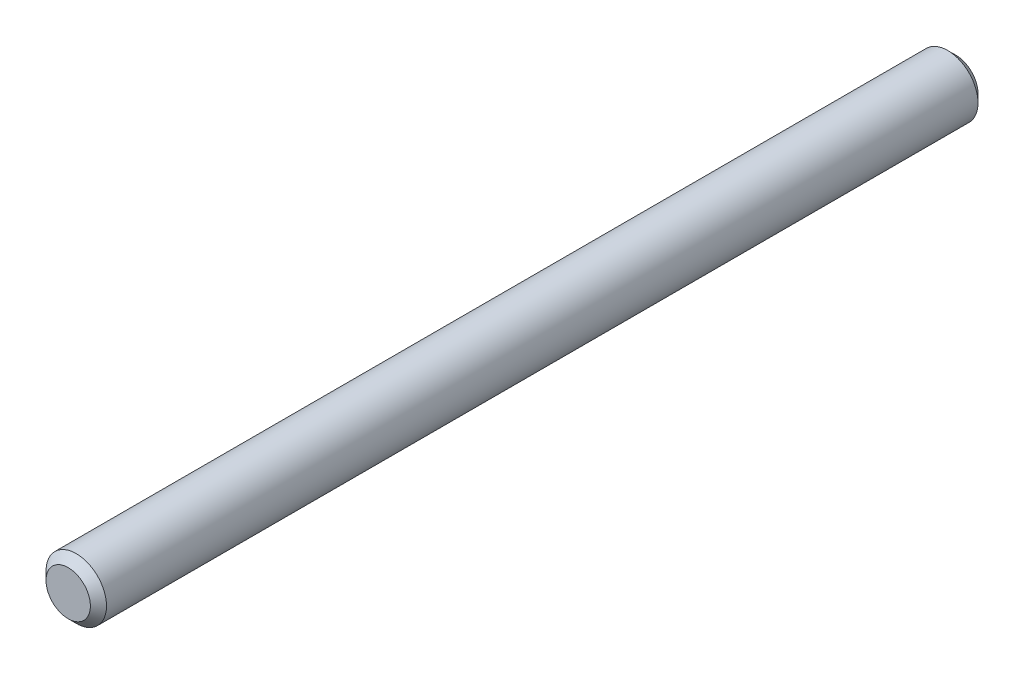
ISO-10303-21;
HEADER;
FILE_DESCRIPTION(('STEP AP214'),'2;1');
FILE_NAME('part.step','',(''),(''),'','','');
FILE_SCHEMA(('AUTOMOTIVE_DESIGN { 1 0 10303 214 1 1 1 1 }'));
ENDSEC;
DATA;
#1=APPLICATION_CONTEXT('core data for automotive mechanical design processes');
#2=APPLICATION_PROTOCOL_DEFINITION('international standard','automotive_design',2000,#1);
#3=PRODUCT_CONTEXT('',#1,'mechanical');
#4=PRODUCT('Part','Part','',(#3));
#5=PRODUCT_RELATED_PRODUCT_CATEGORY('part','',(#4));
#6=PRODUCT_DEFINITION_FORMATION('','',#4);
#7=PRODUCT_DEFINITION_CONTEXT('part definition',#1,'design');
#8=PRODUCT_DEFINITION('design','',#6,#7);
#9=PRODUCT_DEFINITION_SHAPE('','',#8);
#10=(LENGTH_UNIT() NAMED_UNIT(*) SI_UNIT(.MILLI.,.METRE.));
#11=(NAMED_UNIT(*) PLANE_ANGLE_UNIT() SI_UNIT($,.RADIAN.));
#12=(NAMED_UNIT(*) SI_UNIT($,.STERADIAN.) SOLID_ANGLE_UNIT());
#13=UNCERTAINTY_MEASURE_WITH_UNIT(LENGTH_MEASURE(1.E-05),#10,'distance_accuracy_value','');
#14=(GEOMETRIC_REPRESENTATION_CONTEXT(3) GLOBAL_UNCERTAINTY_ASSIGNED_CONTEXT((#13)) GLOBAL_UNIT_ASSIGNED_CONTEXT((#10,
#11,#12)) REPRESENTATION_CONTEXT('',''));
#15=CARTESIAN_POINT('',(0.,0.,0.));
#16=DIRECTION('',(0.,0.,1.));
#17=DIRECTION('',(1.,0.,0.));
#18=AXIS2_PLACEMENT_3D('',#15,#16,#17);
#19=CARTESIAN_POINT('',(0.,0.,110.));
#20=DIRECTION('',(0.,0.,-1.));
#21=DIRECTION('',(-1.,0.,0.));
#22=AXIS2_PLACEMENT_3D('',#19,#20,#21);
#23=CYLINDRICAL_SURFACE('',#22,7.5);
#24=CARTESIAN_POINT('',(0.,0.,108.));
#25=DIRECTION('',(0.,0.,1.));
#26=DIRECTION('',(1.,0.,0.));
#27=AXIS2_PLACEMENT_3D('',#24,#25,#26);
#28=CIRCLE('',#27,7.5);
#29=CARTESIAN_POINT('',(7.5,0.,108.));
#30=VERTEX_POINT('',#29);
#31=EDGE_CURVE('E10',#30,#30,#28,.F.);
#32=ORIENTED_EDGE('',*,*,#31,.T.);
#33=EDGE_LOOP('',(#32));
#34=FACE_BOUND('',#33,.T.);
#35=CARTESIAN_POINT('',(0.,0.,-108.));
#36=DIRECTION('',(0.,0.,1.));
#37=DIRECTION('',(1.,0.,0.));
#38=AXIS2_PLACEMENT_3D('',#35,#36,#37);
#39=CIRCLE('',#38,7.5);
#40=CARTESIAN_POINT('',(7.5,0.,-108.));
#41=VERTEX_POINT('',#40);
#42=EDGE_CURVE('E54',#41,#41,#39,.T.);
#43=ORIENTED_EDGE('',*,*,#42,.T.);
#44=EDGE_LOOP('',(#43));
#45=FACE_BOUND('',#44,.T.);
#46=ADVANCED_FACE('F39',(#34,#45),#23,.T.);
#47=CARTESIAN_POINT('',(0.,0.,110.));
#48=DIRECTION('',(0.,0.,1.));
#49=DIRECTION('',(1.,0.,0.));
#50=AXIS2_PLACEMENT_3D('',#47,#48,#49);
#51=PLANE('',#50);
#52=CARTESIAN_POINT('',(0.,0.,110.));
#53=DIRECTION('',(0.,0.,1.));
#54=DIRECTION('',(1.,0.,0.));
#55=AXIS2_PLACEMENT_3D('',#52,#53,#54);
#56=CIRCLE('',#55,5.50000000000001);
#57=CARTESIAN_POINT('',(5.50000000000001,0.,110.));
#58=VERTEX_POINT('',#57);
#59=EDGE_CURVE('E46',#58,#58,#56,.T.);
#60=ORIENTED_EDGE('',*,*,#59,.T.);
#61=EDGE_LOOP('',(#60));
#62=FACE_BOUND('',#61,.T.);
#63=ADVANCED_FACE('F71',(#62),#51,.T.);
#64=CARTESIAN_POINT('',(0.,0.,-110.));
#65=DIRECTION('',(0.,0.,1.));
#66=DIRECTION('',(1.,0.,0.));
#67=AXIS2_PLACEMENT_3D('',#64,#65,#66);
#68=PLANE('',#67);
#69=CARTESIAN_POINT('',(0.,0.,-110.));
#70=DIRECTION('',(0.,0.,1.));
#71=DIRECTION('',(1.,0.,0.));
#72=AXIS2_PLACEMENT_3D('',#69,#70,#71);
#73=CIRCLE('',#72,5.50000000000003);
#74=CARTESIAN_POINT('',(5.50000000000003,0.,-110.));
#75=VERTEX_POINT('',#74);
#76=EDGE_CURVE('E50',#75,#75,#73,.F.);
#77=ORIENTED_EDGE('',*,*,#76,.T.);
#78=EDGE_LOOP('',(#77));
#79=FACE_BOUND('',#78,.T.);
#80=ADVANCED_FACE('F63',(#79),#68,.F.);
#81=CARTESIAN_POINT('',(0.,0.,-108.));
#82=DIRECTION('',(0.,0.,1.));
#83=DIRECTION('',(1.,0.,0.));
#84=AXIS2_PLACEMENT_3D('',#81,#82,#83);
#85=CONICAL_SURFACE('',#84,7.5,0.785398163397454);
#86=ORIENTED_EDGE('',*,*,#76,.F.);
#87=EDGE_LOOP('',(#86));
#88=FACE_BOUND('',#87,.T.);
#89=ORIENTED_EDGE('',*,*,#42,.F.);
#90=EDGE_LOOP('',(#89));
#91=FACE_BOUND('',#90,.T.);
#92=ADVANCED_FACE('F61',(#88,#91),#85,.T.);
#93=CARTESIAN_POINT('',(0.,0.,110.));
#94=DIRECTION('',(0.,0.,-1.));
#95=DIRECTION('',(-1.,0.,0.));
#96=AXIS2_PLACEMENT_3D('',#93,#94,#95);
#97=CONICAL_SURFACE('',#96,5.50000000000001,0.785398163397453);
#98=ORIENTED_EDGE('',*,*,#31,.F.);
#99=EDGE_LOOP('',(#98));
#100=FACE_BOUND('',#99,.T.);
#101=ORIENTED_EDGE('',*,*,#59,.F.);
#102=EDGE_LOOP('',(#101));
#103=FACE_BOUND('',#102,.T.);
#104=ADVANCED_FACE('F41',(#100,#103),#97,.T.);
#105=CLOSED_SHELL('',(#46,#63,#80,#92,#104));
#106=MANIFOLD_SOLID_BREP('B2',#105);
#107=ADVANCED_BREP_SHAPE_REPRESENTATION('',(#18,#106),#14);
#108=SHAPE_DEFINITION_REPRESENTATION(#9,#107);
ENDSEC;
END-ISO-10303-21;
